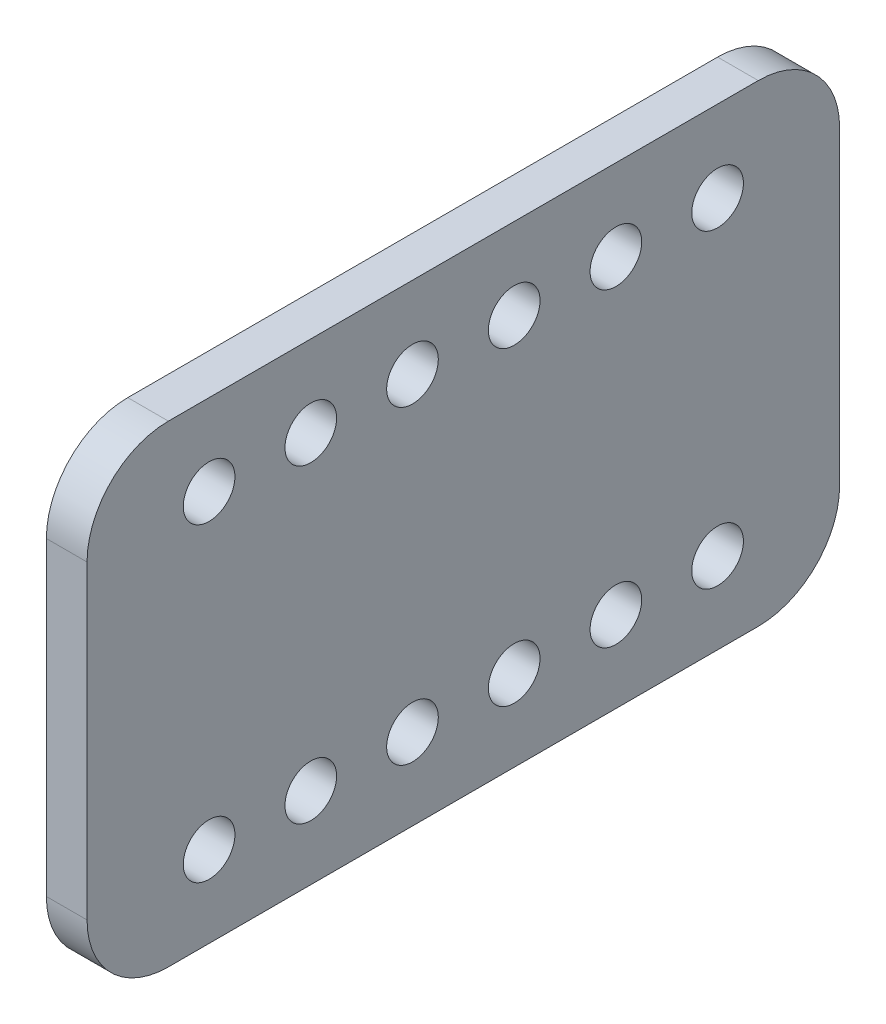
ISO-10303-21;
HEADER;
FILE_DESCRIPTION(('STEP AP214'),'2;1');
FILE_NAME('part.step','',(''),(''),'','','');
FILE_SCHEMA(('AUTOMOTIVE_DESIGN { 1 0 10303 214 1 1 1 1 }'));
ENDSEC;
DATA;
#1=APPLICATION_CONTEXT('core data for automotive mechanical design processes');
#2=APPLICATION_PROTOCOL_DEFINITION('international standard','automotive_design',2000,#1);
#3=PRODUCT_CONTEXT('',#1,'mechanical');
#4=PRODUCT('Part','Part','',(#3));
#5=PRODUCT_RELATED_PRODUCT_CATEGORY('part','',(#4));
#6=PRODUCT_DEFINITION_FORMATION('','',#4);
#7=PRODUCT_DEFINITION_CONTEXT('part definition',#1,'design');
#8=PRODUCT_DEFINITION('design','',#6,#7);
#9=PRODUCT_DEFINITION_SHAPE('','',#8);
#10=(LENGTH_UNIT() NAMED_UNIT(*) SI_UNIT(.MILLI.,.METRE.));
#11=(NAMED_UNIT(*) PLANE_ANGLE_UNIT() SI_UNIT($,.RADIAN.));
#12=(NAMED_UNIT(*) SI_UNIT($,.STERADIAN.) SOLID_ANGLE_UNIT());
#13=UNCERTAINTY_MEASURE_WITH_UNIT(LENGTH_MEASURE(1.E-05),#10,'distance_accuracy_value','');
#14=(GEOMETRIC_REPRESENTATION_CONTEXT(3) GLOBAL_UNCERTAINTY_ASSIGNED_CONTEXT((#13)) GLOBAL_UNIT_ASSIGNED_CONTEXT((#10,
#11,#12)) REPRESENTATION_CONTEXT('',''));
#15=CARTESIAN_POINT('',(0.,0.,0.));
#16=DIRECTION('',(0.,0.,1.));
#17=DIRECTION('',(1.,0.,0.));
#18=AXIS2_PLACEMENT_3D('',#15,#16,#17);
#19=CARTESIAN_POINT('',(1.,0.,0.));
#20=DIRECTION('',(-1.,0.,0.));
#21=DIRECTION('',(0.,0.,1.));
#22=AXIS2_PLACEMENT_3D('',#19,#20,#21);
#23=PLANE('',#22);
#24=DIRECTION('',(0.,-1.,0.));
#25=VECTOR('',#24,1.);
#26=CARTESIAN_POINT('',(1.,0.,0.));
#27=LINE('',#26,#25);
#28=CARTESIAN_POINT('',(1.,9.61999999999998,0.));
#29=VERTEX_POINT('',#28);
#30=CARTESIAN_POINT('',(1.,2.,0.));
#31=VERTEX_POINT('',#30);
#32=EDGE_CURVE('E140',#29,#31,#27,.T.);
#33=ORIENTED_EDGE('',*,*,#32,.T.);
#34=CARTESIAN_POINT('',(1.,2.,-2.));
#35=DIRECTION('',(-1.,0.,0.));
#36=DIRECTION('',(0.,0.,1.));
#37=AXIS2_PLACEMENT_3D('',#34,#35,#36);
#38=CIRCLE('',#37,2.);
#39=CARTESIAN_POINT('',(1.,0.,-2.));
#40=VERTEX_POINT('',#39);
#41=EDGE_CURVE('E154',#31,#40,#38,.F.);
#42=ORIENTED_EDGE('',*,*,#41,.T.);
#43=DIRECTION('',(0.,0.,-1.));
#44=VECTOR('',#43,1.);
#45=CARTESIAN_POINT('',(1.,0.,0.));
#46=LINE('',#45,#44);
#47=CARTESIAN_POINT('',(1.,0.,-16.5));
#48=VERTEX_POINT('',#47);
#49=EDGE_CURVE('E121',#40,#48,#46,.T.);
#50=ORIENTED_EDGE('',*,*,#49,.T.);
#51=CARTESIAN_POINT('',(1.,2.,-16.5));
#52=DIRECTION('',(-1.,0.,0.));
#53=DIRECTION('',(0.,0.,1.));
#54=AXIS2_PLACEMENT_3D('',#51,#52,#53);
#55=CIRCLE('',#54,2.);
#56=CARTESIAN_POINT('',(1.,2.,-18.5));
#57=VERTEX_POINT('',#56);
#58=EDGE_CURVE('E150',#48,#57,#55,.F.);
#59=ORIENTED_EDGE('',*,*,#58,.T.);
#60=DIRECTION('',(0.,1.,0.));
#61=VECTOR('',#60,1.);
#62=CARTESIAN_POINT('',(1.,0.,-18.5));
#63=LINE('',#62,#61);
#64=CARTESIAN_POINT('',(1.,9.61999999999998,-18.5));
#65=VERTEX_POINT('',#64);
#66=EDGE_CURVE('E163',#57,#65,#63,.T.);
#67=ORIENTED_EDGE('',*,*,#66,.T.);
#68=CARTESIAN_POINT('',(1.,9.61999999999998,-16.5));
#69=DIRECTION('',(-1.,0.,0.));
#70=DIRECTION('',(0.,0.,1.));
#71=AXIS2_PLACEMENT_3D('',#68,#69,#70);
#72=CIRCLE('',#71,2.);
#73=CARTESIAN_POINT('',(1.,11.62,-16.5));
#74=VERTEX_POINT('',#73);
#75=EDGE_CURVE('E56',#65,#74,#72,.F.);
#76=ORIENTED_EDGE('',*,*,#75,.T.);
#77=DIRECTION('',(0.,0.,1.));
#78=VECTOR('',#77,1.);
#79=CARTESIAN_POINT('',(1.,11.62,0.));
#80=LINE('',#79,#78);
#81=CARTESIAN_POINT('',(1.,11.62,-2.));
#82=VERTEX_POINT('',#81);
#83=EDGE_CURVE('E141',#74,#82,#80,.T.);
#84=ORIENTED_EDGE('',*,*,#83,.T.);
#85=CARTESIAN_POINT('',(1.,9.61999999999998,-2.));
#86=DIRECTION('',(-1.,0.,0.));
#87=DIRECTION('',(0.,0.,1.));
#88=AXIS2_PLACEMENT_3D('',#85,#86,#87);
#89=CIRCLE('',#88,2.);
#90=EDGE_CURVE('E152',#82,#29,#89,.F.);
#91=ORIENTED_EDGE('',*,*,#90,.T.);
#92=EDGE_LOOP('',(#33,#42,#50,#59,#67,#76,#84,#91));
#93=FACE_BOUND('',#92,.T.);
#94=CARTESIAN_POINT('',(1.,9.62000000000002,-15.5));
#95=DIRECTION('',(1.,0.,0.));
#96=DIRECTION('',(0.,0.,-1.));
#97=AXIS2_PLACEMENT_3D('',#94,#95,#96);
#98=CIRCLE('',#97,0.634999999999995);
#99=CARTESIAN_POINT('',(1.,9.62000000000002,-16.135));
#100=VERTEX_POINT('',#99);
#101=EDGE_CURVE('E135',#100,#100,#98,.T.);
#102=ORIENTED_EDGE('',*,*,#101,.F.);
#103=EDGE_LOOP('',(#102));
#104=FACE_BOUND('',#103,.T.);
#105=CARTESIAN_POINT('',(1.,9.62,-13.));
#106=DIRECTION('',(1.,0.,0.));
#107=DIRECTION('',(0.,0.,-1.));
#108=AXIS2_PLACEMENT_3D('',#105,#106,#107);
#109=CIRCLE('',#108,0.634999999999999);
#110=CARTESIAN_POINT('',(1.,9.62,-13.635));
#111=VERTEX_POINT('',#110);
#112=EDGE_CURVE('E186',#111,#111,#109,.T.);
#113=ORIENTED_EDGE('',*,*,#112,.F.);
#114=EDGE_LOOP('',(#113));
#115=FACE_BOUND('',#114,.T.);
#116=CARTESIAN_POINT('',(1.,9.61999999999998,-10.5));
#117=DIRECTION('',(1.,0.,0.));
#118=DIRECTION('',(0.,0.,-1.));
#119=AXIS2_PLACEMENT_3D('',#116,#117,#118);
#120=CIRCLE('',#119,0.634999999999999);
#121=CARTESIAN_POINT('',(1.,9.61999999999998,-11.135));
#122=VERTEX_POINT('',#121);
#123=EDGE_CURVE('E192',#122,#122,#120,.T.);
#124=ORIENTED_EDGE('',*,*,#123,.F.);
#125=EDGE_LOOP('',(#124));
#126=FACE_BOUND('',#125,.T.);
#127=CARTESIAN_POINT('',(1.,9.61999999999997,-8.));
#128=DIRECTION('',(1.,0.,0.));
#129=DIRECTION('',(0.,0.,-1.));
#130=AXIS2_PLACEMENT_3D('',#127,#128,#129);
#131=CIRCLE('',#130,0.634999999999999);
#132=CARTESIAN_POINT('',(1.,9.61999999999997,-8.63499999999999));
#133=VERTEX_POINT('',#132);
#134=EDGE_CURVE('E198',#133,#133,#131,.T.);
#135=ORIENTED_EDGE('',*,*,#134,.F.);
#136=EDGE_LOOP('',(#135));
#137=FACE_BOUND('',#136,.T.);
#138=CARTESIAN_POINT('',(1.,9.61999999999995,-5.5));
#139=DIRECTION('',(1.,0.,0.));
#140=DIRECTION('',(0.,0.,-1.));
#141=AXIS2_PLACEMENT_3D('',#138,#139,#140);
#142=CIRCLE('',#141,0.634999999999999);
#143=CARTESIAN_POINT('',(1.,9.61999999999995,-6.135));
#144=VERTEX_POINT('',#143);
#145=EDGE_CURVE('E204',#144,#144,#142,.T.);
#146=ORIENTED_EDGE('',*,*,#145,.F.);
#147=EDGE_LOOP('',(#146));
#148=FACE_BOUND('',#147,.T.);
#149=CARTESIAN_POINT('',(1.,9.61999999999993,-3.));
#150=DIRECTION('',(1.,0.,0.));
#151=DIRECTION('',(0.,0.,-1.));
#152=AXIS2_PLACEMENT_3D('',#149,#150,#151);
#153=CIRCLE('',#152,0.634999999999999);
#154=CARTESIAN_POINT('',(1.,9.61999999999993,-3.635));
#155=VERTEX_POINT('',#154);
#156=EDGE_CURVE('E210',#155,#155,#153,.T.);
#157=ORIENTED_EDGE('',*,*,#156,.F.);
#158=EDGE_LOOP('',(#157));
#159=FACE_BOUND('',#158,.T.);
#160=CARTESIAN_POINT('',(1.,2.,-13.0000000000001));
#161=DIRECTION('',(1.,0.,0.));
#162=DIRECTION('',(0.,0.,-1.));
#163=AXIS2_PLACEMENT_3D('',#160,#161,#162);
#164=CIRCLE('',#163,0.634999999999999);
#165=CARTESIAN_POINT('',(1.,2.,-13.6350000000001));
#166=VERTEX_POINT('',#165);
#167=EDGE_CURVE('E216',#166,#166,#164,.T.);
#168=ORIENTED_EDGE('',*,*,#167,.F.);
#169=EDGE_LOOP('',(#168));
#170=FACE_BOUND('',#169,.T.);
#171=CARTESIAN_POINT('',(1.,1.99999999999998,-10.5000000000001));
#172=DIRECTION('',(1.,0.,0.));
#173=DIRECTION('',(0.,0.,-1.));
#174=AXIS2_PLACEMENT_3D('',#171,#172,#173);
#175=CIRCLE('',#174,0.634999999999999);
#176=CARTESIAN_POINT('',(1.,1.99999999999998,-11.1350000000001));
#177=VERTEX_POINT('',#176);
#178=EDGE_CURVE('E222',#177,#177,#175,.T.);
#179=ORIENTED_EDGE('',*,*,#178,.F.);
#180=EDGE_LOOP('',(#179));
#181=FACE_BOUND('',#180,.T.);
#182=CARTESIAN_POINT('',(1.,1.99999999999997,-8.00000000000008));
#183=DIRECTION('',(1.,0.,0.));
#184=DIRECTION('',(0.,0.,-1.));
#185=AXIS2_PLACEMENT_3D('',#182,#183,#184);
#186=CIRCLE('',#185,0.634999999999999);
#187=CARTESIAN_POINT('',(1.,1.99999999999997,-8.63500000000008));
#188=VERTEX_POINT('',#187);
#189=EDGE_CURVE('E228',#188,#188,#186,.T.);
#190=ORIENTED_EDGE('',*,*,#189,.F.);
#191=EDGE_LOOP('',(#190));
#192=FACE_BOUND('',#191,.T.);
#193=CARTESIAN_POINT('',(1.,1.99999999999995,-5.50000000000008));
#194=DIRECTION('',(1.,0.,0.));
#195=DIRECTION('',(0.,0.,-1.));
#196=AXIS2_PLACEMENT_3D('',#193,#194,#195);
#197=CIRCLE('',#196,0.634999999999999);
#198=CARTESIAN_POINT('',(1.,1.99999999999995,-6.13500000000008));
#199=VERTEX_POINT('',#198);
#200=EDGE_CURVE('E234',#199,#199,#197,.T.);
#201=ORIENTED_EDGE('',*,*,#200,.F.);
#202=EDGE_LOOP('',(#201));
#203=FACE_BOUND('',#202,.T.);
#204=CARTESIAN_POINT('',(1.,1.99999999999993,-3.00000000000008));
#205=DIRECTION('',(1.,0.,0.));
#206=DIRECTION('',(0.,0.,-1.));
#207=AXIS2_PLACEMENT_3D('',#204,#205,#206);
#208=CIRCLE('',#207,0.634999999999999);
#209=CARTESIAN_POINT('',(1.,1.99999999999993,-3.63500000000008));
#210=VERTEX_POINT('',#209);
#211=EDGE_CURVE('E240',#210,#210,#208,.T.);
#212=ORIENTED_EDGE('',*,*,#211,.F.);
#213=EDGE_LOOP('',(#212));
#214=FACE_BOUND('',#213,.T.);
#215=CARTESIAN_POINT('',(1.,2.00000000000002,-15.5000000000001));
#216=DIRECTION('',(1.,0.,0.));
#217=DIRECTION('',(0.,0.,-1.));
#218=AXIS2_PLACEMENT_3D('',#215,#216,#217);
#219=CIRCLE('',#218,0.634999999999999);
#220=CARTESIAN_POINT('',(1.,2.00000000000002,-16.1350000000001));
#221=VERTEX_POINT('',#220);
#222=EDGE_CURVE('E246',#221,#221,#219,.T.);
#223=ORIENTED_EDGE('',*,*,#222,.F.);
#224=EDGE_LOOP('',(#223));
#225=FACE_BOUND('',#224,.T.);
#226=ADVANCED_FACE('F34',(#93,#104,#115,#126,#137,#148,#159,#170,#181,#192,#203,#214,#225),#23,.F.);
#227=CARTESIAN_POINT('',(0.,0.,0.));
#228=DIRECTION('',(-1.,0.,0.));
#229=DIRECTION('',(0.,0.,1.));
#230=AXIS2_PLACEMENT_3D('',#227,#228,#229);
#231=PLANE('',#230);
#232=CARTESIAN_POINT('',(0.,1.99999999999993,-3.00000000000008));
#233=DIRECTION('',(1.,0.,0.));
#234=DIRECTION('',(0.,0.,-1.));
#235=AXIS2_PLACEMENT_3D('',#232,#233,#234);
#236=CIRCLE('',#235,0.634999999999999);
#237=CARTESIAN_POINT('',(0.,1.99999999999993,-3.63500000000008));
#238=VERTEX_POINT('',#237);
#239=EDGE_CURVE('E243',#238,#238,#236,.T.);
#240=ORIENTED_EDGE('',*,*,#239,.T.);
#241=EDGE_LOOP('',(#240));
#242=FACE_BOUND('',#241,.T.);
#243=CARTESIAN_POINT('',(0.,1.99999999999997,-8.00000000000008));
#244=DIRECTION('',(1.,0.,0.));
#245=DIRECTION('',(0.,0.,-1.));
#246=AXIS2_PLACEMENT_3D('',#243,#244,#245);
#247=CIRCLE('',#246,0.634999999999999);
#248=CARTESIAN_POINT('',(0.,1.99999999999997,-8.63500000000008));
#249=VERTEX_POINT('',#248);
#250=EDGE_CURVE('E231',#249,#249,#247,.T.);
#251=ORIENTED_EDGE('',*,*,#250,.T.);
#252=EDGE_LOOP('',(#251));
#253=FACE_BOUND('',#252,.T.);
#254=CARTESIAN_POINT('',(0.,2.,-13.0000000000001));
#255=DIRECTION('',(1.,0.,0.));
#256=DIRECTION('',(0.,0.,-1.));
#257=AXIS2_PLACEMENT_3D('',#254,#255,#256);
#258=CIRCLE('',#257,0.634999999999999);
#259=CARTESIAN_POINT('',(0.,2.,-13.6350000000001));
#260=VERTEX_POINT('',#259);
#261=EDGE_CURVE('E219',#260,#260,#258,.T.);
#262=ORIENTED_EDGE('',*,*,#261,.T.);
#263=EDGE_LOOP('',(#262));
#264=FACE_BOUND('',#263,.T.);
#265=CARTESIAN_POINT('',(0.,9.61999999999995,-5.5));
#266=DIRECTION('',(1.,0.,0.));
#267=DIRECTION('',(0.,0.,-1.));
#268=AXIS2_PLACEMENT_3D('',#265,#266,#267);
#269=CIRCLE('',#268,0.634999999999999);
#270=CARTESIAN_POINT('',(0.,9.61999999999995,-6.135));
#271=VERTEX_POINT('',#270);
#272=EDGE_CURVE('E207',#271,#271,#269,.T.);
#273=ORIENTED_EDGE('',*,*,#272,.T.);
#274=EDGE_LOOP('',(#273));
#275=FACE_BOUND('',#274,.T.);
#276=CARTESIAN_POINT('',(0.,9.61999999999998,-10.5));
#277=DIRECTION('',(1.,0.,0.));
#278=DIRECTION('',(0.,0.,-1.));
#279=AXIS2_PLACEMENT_3D('',#276,#277,#278);
#280=CIRCLE('',#279,0.634999999999999);
#281=CARTESIAN_POINT('',(0.,9.61999999999998,-11.135));
#282=VERTEX_POINT('',#281);
#283=EDGE_CURVE('E195',#282,#282,#280,.T.);
#284=ORIENTED_EDGE('',*,*,#283,.T.);
#285=EDGE_LOOP('',(#284));
#286=FACE_BOUND('',#285,.T.);
#287=CARTESIAN_POINT('',(0.,9.62000000000002,-15.5));
#288=DIRECTION('',(1.,0.,0.));
#289=DIRECTION('',(0.,0.,-1.));
#290=AXIS2_PLACEMENT_3D('',#287,#288,#289);
#291=CIRCLE('',#290,0.634999999999995);
#292=CARTESIAN_POINT('',(0.,9.62000000000002,-16.135));
#293=VERTEX_POINT('',#292);
#294=EDGE_CURVE('E183',#293,#293,#291,.T.);
#295=ORIENTED_EDGE('',*,*,#294,.T.);
#296=EDGE_LOOP('',(#295));
#297=FACE_BOUND('',#296,.T.);
#298=DIRECTION('',(0.,0.,-1.));
#299=VECTOR('',#298,1.);
#300=CARTESIAN_POINT('',(0.,0.,0.));
#301=LINE('',#300,#299);
#302=CARTESIAN_POINT('',(0.,0.,-2.));
#303=VERTEX_POINT('',#302);
#304=CARTESIAN_POINT('',(0.,0.,-16.5));
#305=VERTEX_POINT('',#304);
#306=EDGE_CURVE('E118',#303,#305,#301,.T.);
#307=ORIENTED_EDGE('',*,*,#306,.F.);
#308=CARTESIAN_POINT('',(0.,2.,-2.));
#309=DIRECTION('',(-1.,0.,0.));
#310=DIRECTION('',(0.,0.,1.));
#311=AXIS2_PLACEMENT_3D('',#308,#309,#310);
#312=CIRCLE('',#311,2.);
#313=CARTESIAN_POINT('',(0.,2.,0.));
#314=VERTEX_POINT('',#313);
#315=EDGE_CURVE('E101',#303,#314,#312,.T.);
#316=ORIENTED_EDGE('',*,*,#315,.T.);
#317=DIRECTION('',(0.,-1.,0.));
#318=VECTOR('',#317,1.);
#319=CARTESIAN_POINT('',(0.,0.,0.));
#320=LINE('',#319,#318);
#321=CARTESIAN_POINT('',(0.,9.61999999999998,0.));
#322=VERTEX_POINT('',#321);
#323=EDGE_CURVE('E130',#322,#314,#320,.T.);
#324=ORIENTED_EDGE('',*,*,#323,.F.);
#325=CARTESIAN_POINT('',(0.,9.61999999999998,-2.));
#326=DIRECTION('',(-1.,0.,0.));
#327=DIRECTION('',(0.,0.,1.));
#328=AXIS2_PLACEMENT_3D('',#325,#326,#327);
#329=CIRCLE('',#328,2.);
#330=CARTESIAN_POINT('',(0.,11.62,-2.));
#331=VERTEX_POINT('',#330);
#332=EDGE_CURVE('E112',#322,#331,#329,.T.);
#333=ORIENTED_EDGE('',*,*,#332,.T.);
#334=DIRECTION('',(0.,0.,1.));
#335=VECTOR('',#334,1.);
#336=CARTESIAN_POINT('',(0.,11.62,0.));
#337=LINE('',#336,#335);
#338=CARTESIAN_POINT('',(0.,11.62,-16.5));
#339=VERTEX_POINT('',#338);
#340=EDGE_CURVE('E133',#339,#331,#337,.T.);
#341=ORIENTED_EDGE('',*,*,#340,.F.);
#342=CARTESIAN_POINT('',(0.,9.61999999999998,-16.5));
#343=DIRECTION('',(-1.,0.,0.));
#344=DIRECTION('',(0.,0.,1.));
#345=AXIS2_PLACEMENT_3D('',#342,#343,#344);
#346=CIRCLE('',#345,2.);
#347=CARTESIAN_POINT('',(0.,9.61999999999998,-18.5));
#348=VERTEX_POINT('',#347);
#349=EDGE_CURVE('E122',#339,#348,#346,.T.);
#350=ORIENTED_EDGE('',*,*,#349,.T.);
#351=DIRECTION('',(0.,1.,0.));
#352=VECTOR('',#351,1.);
#353=CARTESIAN_POINT('',(0.,0.,-18.5));
#354=LINE('',#353,#352);
#355=CARTESIAN_POINT('',(0.,2.,-18.5));
#356=VERTEX_POINT('',#355);
#357=EDGE_CURVE('E129',#356,#348,#354,.T.);
#358=ORIENTED_EDGE('',*,*,#357,.F.);
#359=CARTESIAN_POINT('',(0.,2.,-16.5));
#360=DIRECTION('',(-1.,0.,0.));
#361=DIRECTION('',(0.,0.,1.));
#362=AXIS2_PLACEMENT_3D('',#359,#360,#361);
#363=CIRCLE('',#362,2.);
#364=EDGE_CURVE('E128',#356,#305,#363,.T.);
#365=ORIENTED_EDGE('',*,*,#364,.T.);
#366=EDGE_LOOP('',(#307,#316,#324,#333,#341,#350,#358,#365));
#367=FACE_BOUND('',#366,.T.);
#368=CARTESIAN_POINT('',(0.,9.62,-13.));
#369=DIRECTION('',(1.,0.,0.));
#370=DIRECTION('',(0.,0.,-1.));
#371=AXIS2_PLACEMENT_3D('',#368,#369,#370);
#372=CIRCLE('',#371,0.634999999999999);
#373=CARTESIAN_POINT('',(0.,9.62,-13.635));
#374=VERTEX_POINT('',#373);
#375=EDGE_CURVE('E189',#374,#374,#372,.T.);
#376=ORIENTED_EDGE('',*,*,#375,.T.);
#377=EDGE_LOOP('',(#376));
#378=FACE_BOUND('',#377,.T.);
#379=CARTESIAN_POINT('',(0.,9.61999999999997,-8.));
#380=DIRECTION('',(1.,0.,0.));
#381=DIRECTION('',(0.,0.,-1.));
#382=AXIS2_PLACEMENT_3D('',#379,#380,#381);
#383=CIRCLE('',#382,0.634999999999999);
#384=CARTESIAN_POINT('',(0.,9.61999999999997,-8.63499999999999));
#385=VERTEX_POINT('',#384);
#386=EDGE_CURVE('E201',#385,#385,#383,.T.);
#387=ORIENTED_EDGE('',*,*,#386,.T.);
#388=EDGE_LOOP('',(#387));
#389=FACE_BOUND('',#388,.T.);
#390=CARTESIAN_POINT('',(0.,9.61999999999993,-3.));
#391=DIRECTION('',(1.,0.,0.));
#392=DIRECTION('',(0.,0.,-1.));
#393=AXIS2_PLACEMENT_3D('',#390,#391,#392);
#394=CIRCLE('',#393,0.634999999999999);
#395=CARTESIAN_POINT('',(0.,9.61999999999993,-3.635));
#396=VERTEX_POINT('',#395);
#397=EDGE_CURVE('E213',#396,#396,#394,.T.);
#398=ORIENTED_EDGE('',*,*,#397,.T.);
#399=EDGE_LOOP('',(#398));
#400=FACE_BOUND('',#399,.T.);
#401=CARTESIAN_POINT('',(0.,1.99999999999998,-10.5000000000001));
#402=DIRECTION('',(1.,0.,0.));
#403=DIRECTION('',(0.,0.,-1.));
#404=AXIS2_PLACEMENT_3D('',#401,#402,#403);
#405=CIRCLE('',#404,0.634999999999999);
#406=CARTESIAN_POINT('',(0.,1.99999999999998,-11.1350000000001));
#407=VERTEX_POINT('',#406);
#408=EDGE_CURVE('E225',#407,#407,#405,.T.);
#409=ORIENTED_EDGE('',*,*,#408,.T.);
#410=EDGE_LOOP('',(#409));
#411=FACE_BOUND('',#410,.T.);
#412=CARTESIAN_POINT('',(0.,1.99999999999995,-5.50000000000008));
#413=DIRECTION('',(1.,0.,0.));
#414=DIRECTION('',(0.,0.,-1.));
#415=AXIS2_PLACEMENT_3D('',#412,#413,#414);
#416=CIRCLE('',#415,0.634999999999999);
#417=CARTESIAN_POINT('',(0.,1.99999999999995,-6.13500000000008));
#418=VERTEX_POINT('',#417);
#419=EDGE_CURVE('E237',#418,#418,#416,.T.);
#420=ORIENTED_EDGE('',*,*,#419,.T.);
#421=EDGE_LOOP('',(#420));
#422=FACE_BOUND('',#421,.T.);
#423=CARTESIAN_POINT('',(0.,2.00000000000002,-15.5000000000001));
#424=DIRECTION('',(1.,0.,0.));
#425=DIRECTION('',(0.,0.,-1.));
#426=AXIS2_PLACEMENT_3D('',#423,#424,#425);
#427=CIRCLE('',#426,0.634999999999999);
#428=CARTESIAN_POINT('',(0.,2.00000000000002,-16.1350000000001));
#429=VERTEX_POINT('',#428);
#430=EDGE_CURVE('E249',#429,#429,#427,.T.);
#431=ORIENTED_EDGE('',*,*,#430,.T.);
#432=EDGE_LOOP('',(#431));
#433=FACE_BOUND('',#432,.T.);
#434=ADVANCED_FACE('F125',(#242,#253,#264,#275,#286,#297,#367,#378,#389,#400,#411,#422,#433),
#231,.T.);
#435=CARTESIAN_POINT('',(1.,0.,0.));
#436=DIRECTION('',(0.,0.,-1.));
#437=DIRECTION('',(-1.,0.,0.));
#438=AXIS2_PLACEMENT_3D('',#435,#436,#437);
#439=PLANE('',#438);
#440=ORIENTED_EDGE('',*,*,#323,.T.);
#441=DIRECTION('',(-1.,0.,0.));
#442=VECTOR('',#441,1.);
#443=CARTESIAN_POINT('',(1.,2.,0.));
#444=LINE('',#443,#442);
#445=EDGE_CURVE('E106',#314,#31,#444,.F.);
#446=ORIENTED_EDGE('',*,*,#445,.T.);
#447=ORIENTED_EDGE('',*,*,#32,.F.);
#448=DIRECTION('',(-1.,0.,0.));
#449=VECTOR('',#448,1.);
#450=CARTESIAN_POINT('',(1.,9.61999999999998,0.));
#451=LINE('',#450,#449);
#452=EDGE_CURVE('E111',#29,#322,#451,.T.);
#453=ORIENTED_EDGE('',*,*,#452,.T.);
#454=EDGE_LOOP('',(#440,#446,#447,#453));
#455=FACE_BOUND('',#454,.T.);
#456=ADVANCED_FACE('F179',(#455),#439,.F.);
#457=CARTESIAN_POINT('',(1.,0.,0.));
#458=DIRECTION('',(0.,1.,0.));
#459=DIRECTION('',(0.,0.,1.));
#460=AXIS2_PLACEMENT_3D('',#457,#458,#459);
#461=PLANE('',#460);
#462=ORIENTED_EDGE('',*,*,#49,.F.);
#463=DIRECTION('',(-1.,0.,0.));
#464=VECTOR('',#463,1.);
#465=CARTESIAN_POINT('',(1.,0.,-2.));
#466=LINE('',#465,#464);
#467=EDGE_CURVE('E105',#40,#303,#466,.T.);
#468=ORIENTED_EDGE('',*,*,#467,.T.);
#469=ORIENTED_EDGE('',*,*,#306,.T.);
#470=DIRECTION('',(-1.,0.,0.));
#471=VECTOR('',#470,1.);
#472=CARTESIAN_POINT('',(1.,0.,-16.5));
#473=LINE('',#472,#471);
#474=EDGE_CURVE('E123',#305,#48,#473,.F.);
#475=ORIENTED_EDGE('',*,*,#474,.T.);
#476=EDGE_LOOP('',(#462,#468,#469,#475));
#477=FACE_BOUND('',#476,.T.);
#478=ADVANCED_FACE('F117',(#477),#461,.F.);
#479=CARTESIAN_POINT('',(1.,0.,-18.5));
#480=DIRECTION('',(0.,0.,1.));
#481=DIRECTION('',(0.,-1.,0.));
#482=AXIS2_PLACEMENT_3D('',#479,#480,#481);
#483=PLANE('',#482);
#484=ORIENTED_EDGE('',*,*,#66,.F.);
#485=DIRECTION('',(-1.,0.,0.));
#486=VECTOR('',#485,1.);
#487=CARTESIAN_POINT('',(1.,2.,-18.5));
#488=LINE('',#487,#486);
#489=EDGE_CURVE('E11',#57,#356,#488,.T.);
#490=ORIENTED_EDGE('',*,*,#489,.T.);
#491=ORIENTED_EDGE('',*,*,#357,.T.);
#492=DIRECTION('',(-1.,0.,0.));
#493=VECTOR('',#492,1.);
#494=CARTESIAN_POINT('',(1.,9.61999999999998,-18.5));
#495=LINE('',#494,#493);
#496=EDGE_CURVE('E42',#348,#65,#495,.F.);
#497=ORIENTED_EDGE('',*,*,#496,.T.);
#498=EDGE_LOOP('',(#484,#490,#491,#497));
#499=FACE_BOUND('',#498,.T.);
#500=ADVANCED_FACE('F162',(#499),#483,.F.);
#501=CARTESIAN_POINT('',(1.,11.62,0.));
#502=DIRECTION('',(0.,-1.,0.));
#503=DIRECTION('',(0.,0.,-1.));
#504=AXIS2_PLACEMENT_3D('',#501,#502,#503);
#505=PLANE('',#504);
#506=ORIENTED_EDGE('',*,*,#340,.T.);
#507=DIRECTION('',(-1.,0.,0.));
#508=VECTOR('',#507,1.);
#509=CARTESIAN_POINT('',(1.,11.62,-2.));
#510=LINE('',#509,#508);
#511=EDGE_CURVE('E49',#331,#82,#510,.F.);
#512=ORIENTED_EDGE('',*,*,#511,.T.);
#513=ORIENTED_EDGE('',*,*,#83,.F.);
#514=DIRECTION('',(-1.,0.,0.));
#515=VECTOR('',#514,1.);
#516=CARTESIAN_POINT('',(1.,11.62,-16.5));
#517=LINE('',#516,#515);
#518=EDGE_CURVE('E156',#74,#339,#517,.T.);
#519=ORIENTED_EDGE('',*,*,#518,.T.);
#520=EDGE_LOOP('',(#506,#512,#513,#519));
#521=FACE_BOUND('',#520,.T.);
#522=ADVANCED_FACE('F172',(#521),#505,.F.);
#523=CARTESIAN_POINT('',(1.,9.62000000000002,-15.5));
#524=DIRECTION('',(-1.,0.,0.));
#525=DIRECTION('',(0.,0.,1.));
#526=AXIS2_PLACEMENT_3D('',#523,#524,#525);
#527=CYLINDRICAL_SURFACE('',#526,0.634999999999995);
#528=ORIENTED_EDGE('',*,*,#101,.T.);
#529=EDGE_LOOP('',(#528));
#530=FACE_BOUND('',#529,.T.);
#531=ORIENTED_EDGE('',*,*,#294,.F.);
#532=EDGE_LOOP('',(#531));
#533=FACE_BOUND('',#532,.T.);
#534=ADVANCED_FACE('F266',(#530,#533),#527,.F.);
#535=CARTESIAN_POINT('',(1.,9.62,-13.));
#536=DIRECTION('',(-1.,0.,0.));
#537=DIRECTION('',(0.,0.,1.));
#538=AXIS2_PLACEMENT_3D('',#535,#536,#537);
#539=CYLINDRICAL_SURFACE('',#538,0.634999999999999);
#540=ORIENTED_EDGE('',*,*,#112,.T.);
#541=EDGE_LOOP('',(#540));
#542=FACE_BOUND('',#541,.T.);
#543=ORIENTED_EDGE('',*,*,#375,.F.);
#544=EDGE_LOOP('',(#543));
#545=FACE_BOUND('',#544,.T.);
#546=ADVANCED_FACE('F438',(#542,#545),#539,.F.);
#547=CARTESIAN_POINT('',(1.,9.61999999999998,-10.5));
#548=DIRECTION('',(-1.,0.,0.));
#549=DIRECTION('',(0.,0.,1.));
#550=AXIS2_PLACEMENT_3D('',#547,#548,#549);
#551=CYLINDRICAL_SURFACE('',#550,0.634999999999999);
#552=ORIENTED_EDGE('',*,*,#123,.T.);
#553=EDGE_LOOP('',(#552));
#554=FACE_BOUND('',#553,.T.);
#555=ORIENTED_EDGE('',*,*,#283,.F.);
#556=EDGE_LOOP('',(#555));
#557=FACE_BOUND('',#556,.T.);
#558=ADVANCED_FACE('F428',(#554,#557),#551,.F.);
#559=CARTESIAN_POINT('',(1.,9.61999999999997,-8.));
#560=DIRECTION('',(-1.,0.,0.));
#561=DIRECTION('',(0.,0.,1.));
#562=AXIS2_PLACEMENT_3D('',#559,#560,#561);
#563=CYLINDRICAL_SURFACE('',#562,0.634999999999999);
#564=ORIENTED_EDGE('',*,*,#134,.T.);
#565=EDGE_LOOP('',(#564));
#566=FACE_BOUND('',#565,.T.);
#567=ORIENTED_EDGE('',*,*,#386,.F.);
#568=EDGE_LOOP('',(#567));
#569=FACE_BOUND('',#568,.T.);
#570=ADVANCED_FACE('F418',(#566,#569),#563,.F.);
#571=CARTESIAN_POINT('',(1.,9.61999999999995,-5.5));
#572=DIRECTION('',(-1.,0.,0.));
#573=DIRECTION('',(0.,0.,1.));
#574=AXIS2_PLACEMENT_3D('',#571,#572,#573);
#575=CYLINDRICAL_SURFACE('',#574,0.634999999999999);
#576=ORIENTED_EDGE('',*,*,#145,.T.);
#577=EDGE_LOOP('',(#576));
#578=FACE_BOUND('',#577,.T.);
#579=ORIENTED_EDGE('',*,*,#272,.F.);
#580=EDGE_LOOP('',(#579));
#581=FACE_BOUND('',#580,.T.);
#582=ADVANCED_FACE('F408',(#578,#581),#575,.F.);
#583=CARTESIAN_POINT('',(1.,9.61999999999993,-3.));
#584=DIRECTION('',(-1.,0.,0.));
#585=DIRECTION('',(0.,0.,1.));
#586=AXIS2_PLACEMENT_3D('',#583,#584,#585);
#587=CYLINDRICAL_SURFACE('',#586,0.634999999999999);
#588=ORIENTED_EDGE('',*,*,#156,.T.);
#589=EDGE_LOOP('',(#588));
#590=FACE_BOUND('',#589,.T.);
#591=ORIENTED_EDGE('',*,*,#397,.F.);
#592=EDGE_LOOP('',(#591));
#593=FACE_BOUND('',#592,.T.);
#594=ADVANCED_FACE('F398',(#590,#593),#587,.F.);
#595=CARTESIAN_POINT('',(1.,2.,-13.0000000000001));
#596=DIRECTION('',(-1.,0.,0.));
#597=DIRECTION('',(0.,0.,1.));
#598=AXIS2_PLACEMENT_3D('',#595,#596,#597);
#599=CYLINDRICAL_SURFACE('',#598,0.634999999999999);
#600=ORIENTED_EDGE('',*,*,#167,.T.);
#601=EDGE_LOOP('',(#600));
#602=FACE_BOUND('',#601,.T.);
#603=ORIENTED_EDGE('',*,*,#261,.F.);
#604=EDGE_LOOP('',(#603));
#605=FACE_BOUND('',#604,.T.);
#606=ADVANCED_FACE('F388',(#602,#605),#599,.F.);
#607=CARTESIAN_POINT('',(1.,1.99999999999998,-10.5000000000001));
#608=DIRECTION('',(-1.,0.,0.));
#609=DIRECTION('',(0.,0.,1.));
#610=AXIS2_PLACEMENT_3D('',#607,#608,#609);
#611=CYLINDRICAL_SURFACE('',#610,0.634999999999999);
#612=ORIENTED_EDGE('',*,*,#178,.T.);
#613=EDGE_LOOP('',(#612));
#614=FACE_BOUND('',#613,.T.);
#615=ORIENTED_EDGE('',*,*,#408,.F.);
#616=EDGE_LOOP('',(#615));
#617=FACE_BOUND('',#616,.T.);
#618=ADVANCED_FACE('F378',(#614,#617),#611,.F.);
#619=CARTESIAN_POINT('',(1.,1.99999999999997,-8.00000000000008));
#620=DIRECTION('',(-1.,0.,0.));
#621=DIRECTION('',(0.,0.,1.));
#622=AXIS2_PLACEMENT_3D('',#619,#620,#621);
#623=CYLINDRICAL_SURFACE('',#622,0.634999999999999);
#624=ORIENTED_EDGE('',*,*,#189,.T.);
#625=EDGE_LOOP('',(#624));
#626=FACE_BOUND('',#625,.T.);
#627=ORIENTED_EDGE('',*,*,#250,.F.);
#628=EDGE_LOOP('',(#627));
#629=FACE_BOUND('',#628,.T.);
#630=ADVANCED_FACE('F368',(#626,#629),#623,.F.);
#631=CARTESIAN_POINT('',(1.,1.99999999999995,-5.50000000000008));
#632=DIRECTION('',(-1.,0.,0.));
#633=DIRECTION('',(0.,0.,1.));
#634=AXIS2_PLACEMENT_3D('',#631,#632,#633);
#635=CYLINDRICAL_SURFACE('',#634,0.634999999999999);
#636=ORIENTED_EDGE('',*,*,#200,.T.);
#637=EDGE_LOOP('',(#636));
#638=FACE_BOUND('',#637,.T.);
#639=ORIENTED_EDGE('',*,*,#419,.F.);
#640=EDGE_LOOP('',(#639));
#641=FACE_BOUND('',#640,.T.);
#642=ADVANCED_FACE('F358',(#638,#641),#635,.F.);
#643=CARTESIAN_POINT('',(1.,1.99999999999993,-3.00000000000008));
#644=DIRECTION('',(-1.,0.,0.));
#645=DIRECTION('',(0.,0.,1.));
#646=AXIS2_PLACEMENT_3D('',#643,#644,#645);
#647=CYLINDRICAL_SURFACE('',#646,0.634999999999999);
#648=ORIENTED_EDGE('',*,*,#211,.T.);
#649=EDGE_LOOP('',(#648));
#650=FACE_BOUND('',#649,.T.);
#651=ORIENTED_EDGE('',*,*,#239,.F.);
#652=EDGE_LOOP('',(#651));
#653=FACE_BOUND('',#652,.T.);
#654=ADVANCED_FACE('F349',(#650,#653),#647,.F.);
#655=CARTESIAN_POINT('',(1.,2.00000000000002,-15.5000000000001));
#656=DIRECTION('',(-1.,0.,0.));
#657=DIRECTION('',(0.,0.,1.));
#658=AXIS2_PLACEMENT_3D('',#655,#656,#657);
#659=CYLINDRICAL_SURFACE('',#658,0.634999999999999);
#660=ORIENTED_EDGE('',*,*,#222,.T.);
#661=EDGE_LOOP('',(#660));
#662=FACE_BOUND('',#661,.T.);
#663=ORIENTED_EDGE('',*,*,#430,.F.);
#664=EDGE_LOOP('',(#663));
#665=FACE_BOUND('',#664,.T.);
#666=ADVANCED_FACE('F255',(#662,#665),#659,.F.);
#667=CARTESIAN_POINT('',(1.,2.,-2.));
#668=DIRECTION('',(-1.,0.,0.));
#669=DIRECTION('',(0.,0.,1.));
#670=AXIS2_PLACEMENT_3D('',#667,#668,#669);
#671=CYLINDRICAL_SURFACE('',#670,2.);
#672=ORIENTED_EDGE('',*,*,#41,.F.);
#673=ORIENTED_EDGE('',*,*,#445,.F.);
#674=ORIENTED_EDGE('',*,*,#315,.F.);
#675=ORIENTED_EDGE('',*,*,#467,.F.);
#676=EDGE_LOOP('',(#672,#673,#674,#675));
#677=FACE_BOUND('',#676,.T.);
#678=ADVANCED_FACE('F104',(#677),#671,.T.);
#679=CARTESIAN_POINT('',(1.,9.61999999999998,-2.));
#680=DIRECTION('',(-1.,0.,0.));
#681=DIRECTION('',(0.,0.,1.));
#682=AXIS2_PLACEMENT_3D('',#679,#680,#681);
#683=CYLINDRICAL_SURFACE('',#682,2.);
#684=ORIENTED_EDGE('',*,*,#90,.F.);
#685=ORIENTED_EDGE('',*,*,#511,.F.);
#686=ORIENTED_EDGE('',*,*,#332,.F.);
#687=ORIENTED_EDGE('',*,*,#452,.F.);
#688=EDGE_LOOP('',(#684,#685,#686,#687));
#689=FACE_BOUND('',#688,.T.);
#690=ADVANCED_FACE('F176',(#689),#683,.T.);
#691=CARTESIAN_POINT('',(1.,2.,-16.5));
#692=DIRECTION('',(-1.,0.,0.));
#693=DIRECTION('',(0.,0.,1.));
#694=AXIS2_PLACEMENT_3D('',#691,#692,#693);
#695=CYLINDRICAL_SURFACE('',#694,2.);
#696=ORIENTED_EDGE('',*,*,#58,.F.);
#697=ORIENTED_EDGE('',*,*,#474,.F.);
#698=ORIENTED_EDGE('',*,*,#364,.F.);
#699=ORIENTED_EDGE('',*,*,#489,.F.);
#700=EDGE_LOOP('',(#696,#697,#698,#699));
#701=FACE_BOUND('',#700,.T.);
#702=ADVANCED_FACE('F280',(#701),#695,.T.);
#703=CARTESIAN_POINT('',(1.,9.61999999999998,-16.5));
#704=DIRECTION('',(-1.,0.,0.));
#705=DIRECTION('',(0.,0.,1.));
#706=AXIS2_PLACEMENT_3D('',#703,#704,#705);
#707=CYLINDRICAL_SURFACE('',#706,2.);
#708=ORIENTED_EDGE('',*,*,#75,.F.);
#709=ORIENTED_EDGE('',*,*,#496,.F.);
#710=ORIENTED_EDGE('',*,*,#349,.F.);
#711=ORIENTED_EDGE('',*,*,#518,.F.);
#712=EDGE_LOOP('',(#708,#709,#710,#711));
#713=FACE_BOUND('',#712,.T.);
#714=ADVANCED_FACE('F36',(#713),#707,.T.);
#715=CLOSED_SHELL('',(#226,#434,#456,#478,#500,#522,#534,#546,#558,#570,#582,#594,#606,#618,
#630,#642,#654,#666,#678,#690,#702,#714));
#716=MANIFOLD_SOLID_BREP('B2',#715);
#717=ADVANCED_BREP_SHAPE_REPRESENTATION('',(#18,#716),#14);
#718=SHAPE_DEFINITION_REPRESENTATION(#9,#717);
ENDSEC;
END-ISO-10303-21;
